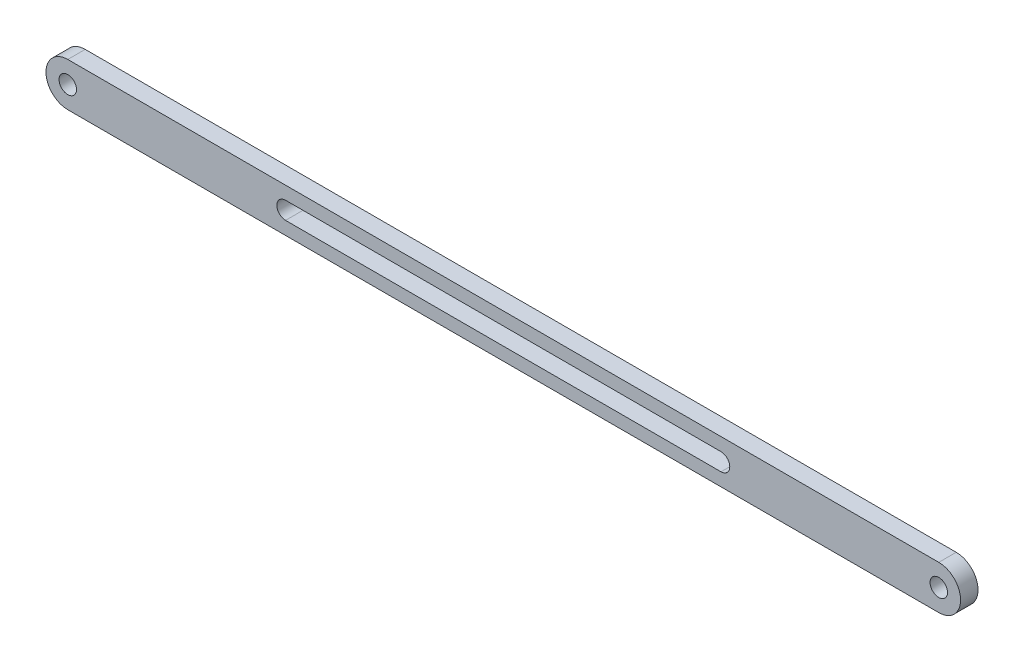
ISO-10303-21;
HEADER;
FILE_DESCRIPTION(('STEP AP214'),'2;1');
FILE_NAME('part.step','',(''),(''),'','','');
FILE_SCHEMA(('AUTOMOTIVE_DESIGN { 1 0 10303 214 1 1 1 1 }'));
ENDSEC;
DATA;
#1=APPLICATION_CONTEXT('core data for automotive mechanical design processes');
#2=APPLICATION_PROTOCOL_DEFINITION('international standard','automotive_design',2000,#1);
#3=PRODUCT_CONTEXT('',#1,'mechanical');
#4=PRODUCT('Part','Part','',(#3));
#5=PRODUCT_RELATED_PRODUCT_CATEGORY('part','',(#4));
#6=PRODUCT_DEFINITION_FORMATION('','',#4);
#7=PRODUCT_DEFINITION_CONTEXT('part definition',#1,'design');
#8=PRODUCT_DEFINITION('design','',#6,#7);
#9=PRODUCT_DEFINITION_SHAPE('','',#8);
#10=(LENGTH_UNIT() NAMED_UNIT(*) SI_UNIT(.MILLI.,.METRE.));
#11=(NAMED_UNIT(*) PLANE_ANGLE_UNIT() SI_UNIT($,.RADIAN.));
#12=(NAMED_UNIT(*) SI_UNIT($,.STERADIAN.) SOLID_ANGLE_UNIT());
#13=UNCERTAINTY_MEASURE_WITH_UNIT(LENGTH_MEASURE(1.E-05),#10,'distance_accuracy_value','');
#14=(GEOMETRIC_REPRESENTATION_CONTEXT(3) GLOBAL_UNCERTAINTY_ASSIGNED_CONTEXT((#13)) GLOBAL_UNIT_ASSIGNED_CONTEXT((#10,
#11,#12)) REPRESENTATION_CONTEXT('',''));
#15=CARTESIAN_POINT('',(0.,0.,0.));
#16=DIRECTION('',(0.,0.,1.));
#17=DIRECTION('',(1.,0.,0.));
#18=AXIS2_PLACEMENT_3D('',#15,#16,#17);
#19=CARTESIAN_POINT('',(0.,0.,4.));
#20=DIRECTION('',(0.,0.,1.));
#21=DIRECTION('',(1.,0.,0.));
#22=AXIS2_PLACEMENT_3D('',#19,#20,#21);
#23=PLANE('',#22);
#24=CARTESIAN_POINT('',(200.,0.,4.));
#25=DIRECTION('',(0.,0.,1.));
#26=DIRECTION('',(1.,0.,0.));
#27=AXIS2_PLACEMENT_3D('',#24,#25,#26);
#28=CIRCLE('',#27,2.);
#29=CARTESIAN_POINT('',(202.,0.,4.));
#30=VERTEX_POINT('',#29);
#31=EDGE_CURVE('E133',#30,#30,#28,.T.);
#32=ORIENTED_EDGE('',*,*,#31,.F.);
#33=EDGE_LOOP('',(#32));
#34=FACE_BOUND('',#33,.T.);
#35=CARTESIAN_POINT('',(0.,0.,4.));
#36=DIRECTION('',(0.,0.,1.));
#37=DIRECTION('',(1.,0.,0.));
#38=AXIS2_PLACEMENT_3D('',#35,#36,#37);
#39=CIRCLE('',#38,5.);
#40=CARTESIAN_POINT('',(0.,5.,4.));
#41=VERTEX_POINT('',#40);
#42=CARTESIAN_POINT('',(0.,-5.,4.));
#43=VERTEX_POINT('',#42);
#44=EDGE_CURVE('E145',#41,#43,#39,.T.);
#45=ORIENTED_EDGE('',*,*,#44,.T.);
#46=DIRECTION('',(1.,0.,0.));
#47=VECTOR('',#46,1.);
#48=CARTESIAN_POINT('',(0.,-5.,4.));
#49=LINE('',#48,#47);
#50=CARTESIAN_POINT('',(200.,-5.,4.));
#51=VERTEX_POINT('',#50);
#52=EDGE_CURVE('E148',#43,#51,#49,.T.);
#53=ORIENTED_EDGE('',*,*,#52,.T.);
#54=CARTESIAN_POINT('',(200.,0.,4.));
#55=DIRECTION('',(0.,0.,1.));
#56=DIRECTION('',(1.,0.,0.));
#57=AXIS2_PLACEMENT_3D('',#54,#55,#56);
#58=CIRCLE('',#57,5.);
#59=CARTESIAN_POINT('',(200.,5.,4.));
#60=VERTEX_POINT('',#59);
#61=EDGE_CURVE('E151',#51,#60,#58,.T.);
#62=ORIENTED_EDGE('',*,*,#61,.T.);
#63=DIRECTION('',(-1.,0.,0.));
#64=VECTOR('',#63,1.);
#65=CARTESIAN_POINT('',(0.,5.,4.));
#66=LINE('',#65,#64);
#67=EDGE_CURVE('E153',#60,#41,#66,.T.);
#68=ORIENTED_EDGE('',*,*,#67,.T.);
#69=EDGE_LOOP('',(#45,#53,#62,#68));
#70=FACE_BOUND('',#69,.T.);
#71=CARTESIAN_POINT('',(0.,0.,4.));
#72=DIRECTION('',(0.,0.,1.));
#73=DIRECTION('',(1.,0.,0.));
#74=AXIS2_PLACEMENT_3D('',#71,#72,#73);
#75=CIRCLE('',#74,2.);
#76=CARTESIAN_POINT('',(2.,0.,4.));
#77=VERTEX_POINT('',#76);
#78=EDGE_CURVE('E139',#77,#77,#75,.T.);
#79=ORIENTED_EDGE('',*,*,#78,.F.);
#80=EDGE_LOOP('',(#79));
#81=FACE_BOUND('',#80,.T.);
#82=DIRECTION('',(1.,0.,0.));
#83=VECTOR('',#82,1.);
#84=CARTESIAN_POINT('',(50.,-2.,4.));
#85=LINE('',#84,#83);
#86=CARTESIAN_POINT('',(50.,-2.,4.));
#87=VERTEX_POINT('',#86);
#88=CARTESIAN_POINT('',(150.,-1.99999999999998,4.));
#89=VERTEX_POINT('',#88);
#90=EDGE_CURVE('E105',#87,#89,#85,.T.);
#91=ORIENTED_EDGE('',*,*,#90,.F.);
#92=CARTESIAN_POINT('',(50.,0.,4.));
#93=DIRECTION('',(0.,0.,1.));
#94=DIRECTION('',(1.,0.,0.));
#95=AXIS2_PLACEMENT_3D('',#92,#93,#94);
#96=CIRCLE('',#95,2.);
#97=CARTESIAN_POINT('',(50.,2.,4.));
#98=VERTEX_POINT('',#97);
#99=EDGE_CURVE('E97',#98,#87,#96,.T.);
#100=ORIENTED_EDGE('',*,*,#99,.F.);
#101=DIRECTION('',(-1.,0.,0.));
#102=VECTOR('',#101,1.);
#103=CARTESIAN_POINT('',(50.,2.,4.));
#104=LINE('',#103,#102);
#105=CARTESIAN_POINT('',(150.,2.00000000000002,4.));
#106=VERTEX_POINT('',#105);
#107=EDGE_CURVE('E119',#106,#98,#104,.T.);
#108=ORIENTED_EDGE('',*,*,#107,.F.);
#109=CARTESIAN_POINT('',(150.,0.,4.));
#110=DIRECTION('',(0.,0.,1.));
#111=DIRECTION('',(1.,0.,0.));
#112=AXIS2_PLACEMENT_3D('',#109,#110,#111);
#113=CIRCLE('',#112,2.);
#114=EDGE_CURVE('E117',#89,#106,#113,.T.);
#115=ORIENTED_EDGE('',*,*,#114,.F.);
#116=EDGE_LOOP('',(#91,#100,#108,#115));
#117=FACE_BOUND('',#116,.T.);
#118=ADVANCED_FACE('F32',(#34,#70,#81,#117),#23,.T.);
#119=CARTESIAN_POINT('',(0.,0.,0.));
#120=DIRECTION('',(0.,0.,1.));
#121=DIRECTION('',(1.,0.,0.));
#122=AXIS2_PLACEMENT_3D('',#119,#120,#121);
#123=PLANE('',#122);
#124=CARTESIAN_POINT('',(200.,0.,0.));
#125=DIRECTION('',(0.,0.,1.));
#126=DIRECTION('',(1.,0.,0.));
#127=AXIS2_PLACEMENT_3D('',#124,#125,#126);
#128=CIRCLE('',#127,2.);
#129=CARTESIAN_POINT('',(202.,0.,0.));
#130=VERTEX_POINT('',#129);
#131=EDGE_CURVE('E113',#130,#130,#128,.T.);
#132=ORIENTED_EDGE('',*,*,#131,.T.);
#133=EDGE_LOOP('',(#132));
#134=FACE_BOUND('',#133,.T.);
#135=CARTESIAN_POINT('',(0.,0.,0.));
#136=DIRECTION('',(0.,0.,1.));
#137=DIRECTION('',(1.,0.,0.));
#138=AXIS2_PLACEMENT_3D('',#135,#136,#137);
#139=CIRCLE('',#138,5.);
#140=CARTESIAN_POINT('',(0.,5.,0.));
#141=VERTEX_POINT('',#140);
#142=CARTESIAN_POINT('',(0.,-5.,0.));
#143=VERTEX_POINT('',#142);
#144=EDGE_CURVE('E142',#141,#143,#139,.T.);
#145=ORIENTED_EDGE('',*,*,#144,.F.);
#146=DIRECTION('',(-1.,0.,0.));
#147=VECTOR('',#146,1.);
#148=CARTESIAN_POINT('',(0.,5.,0.));
#149=LINE('',#148,#147);
#150=CARTESIAN_POINT('',(200.,5.,0.));
#151=VERTEX_POINT('',#150);
#152=EDGE_CURVE('E149',#151,#141,#149,.T.);
#153=ORIENTED_EDGE('',*,*,#152,.F.);
#154=CARTESIAN_POINT('',(200.,0.,0.));
#155=DIRECTION('',(0.,0.,1.));
#156=DIRECTION('',(1.,0.,0.));
#157=AXIS2_PLACEMENT_3D('',#154,#155,#156);
#158=CIRCLE('',#157,5.);
#159=CARTESIAN_POINT('',(200.,-5.,0.));
#160=VERTEX_POINT('',#159);
#161=EDGE_CURVE('E160',#160,#151,#158,.T.);
#162=ORIENTED_EDGE('',*,*,#161,.F.);
#163=DIRECTION('',(1.,0.,0.));
#164=VECTOR('',#163,1.);
#165=CARTESIAN_POINT('',(0.,-5.,0.));
#166=LINE('',#165,#164);
#167=EDGE_CURVE('E158',#143,#160,#166,.T.);
#168=ORIENTED_EDGE('',*,*,#167,.F.);
#169=EDGE_LOOP('',(#145,#153,#162,#168));
#170=FACE_BOUND('',#169,.T.);
#171=CARTESIAN_POINT('',(0.,0.,0.));
#172=DIRECTION('',(0.,0.,1.));
#173=DIRECTION('',(1.,0.,0.));
#174=AXIS2_PLACEMENT_3D('',#171,#172,#173);
#175=CIRCLE('',#174,2.);
#176=CARTESIAN_POINT('',(2.,0.,0.));
#177=VERTEX_POINT('',#176);
#178=EDGE_CURVE('E136',#177,#177,#175,.T.);
#179=ORIENTED_EDGE('',*,*,#178,.T.);
#180=EDGE_LOOP('',(#179));
#181=FACE_BOUND('',#180,.T.);
#182=CARTESIAN_POINT('',(50.,0.,0.));
#183=DIRECTION('',(0.,0.,1.));
#184=DIRECTION('',(1.,0.,0.));
#185=AXIS2_PLACEMENT_3D('',#182,#183,#184);
#186=CIRCLE('',#185,2.);
#187=CARTESIAN_POINT('',(50.,2.,0.));
#188=VERTEX_POINT('',#187);
#189=CARTESIAN_POINT('',(50.,-2.,0.));
#190=VERTEX_POINT('',#189);
#191=EDGE_CURVE('E55',#188,#190,#186,.T.);
#192=ORIENTED_EDGE('',*,*,#191,.T.);
#193=DIRECTION('',(1.,0.,0.));
#194=VECTOR('',#193,1.);
#195=CARTESIAN_POINT('',(50.,-2.,0.));
#196=LINE('',#195,#194);
#197=CARTESIAN_POINT('',(150.,-1.99999999999998,0.));
#198=VERTEX_POINT('',#197);
#199=EDGE_CURVE('E112',#190,#198,#196,.T.);
#200=ORIENTED_EDGE('',*,*,#199,.T.);
#201=CARTESIAN_POINT('',(150.,0.,0.));
#202=DIRECTION('',(0.,0.,1.));
#203=DIRECTION('',(1.,0.,0.));
#204=AXIS2_PLACEMENT_3D('',#201,#202,#203);
#205=CIRCLE('',#204,2.);
#206=CARTESIAN_POINT('',(150.,2.00000000000002,0.));
#207=VERTEX_POINT('',#206);
#208=EDGE_CURVE('E125',#198,#207,#205,.T.);
#209=ORIENTED_EDGE('',*,*,#208,.T.);
#210=DIRECTION('',(-1.,0.,0.));
#211=VECTOR('',#210,1.);
#212=CARTESIAN_POINT('',(50.,2.,0.));
#213=LINE('',#212,#211);
#214=EDGE_CURVE('E106',#207,#188,#213,.T.);
#215=ORIENTED_EDGE('',*,*,#214,.T.);
#216=EDGE_LOOP('',(#192,#200,#209,#215));
#217=FACE_BOUND('',#216,.T.);
#218=ADVANCED_FACE('F178',(#134,#170,#181,#217),#123,.F.);
#219=CARTESIAN_POINT('',(0.,0.,4.));
#220=DIRECTION('',(0.,0.,-1.));
#221=DIRECTION('',(-1.,0.,0.));
#222=AXIS2_PLACEMENT_3D('',#219,#220,#221);
#223=CYLINDRICAL_SURFACE('',#222,5.);
#224=ORIENTED_EDGE('',*,*,#144,.T.);
#225=DIRECTION('',(0.,0.,-1.));
#226=VECTOR('',#225,1.);
#227=CARTESIAN_POINT('',(0.,-5.,4.));
#228=LINE('',#227,#226);
#229=EDGE_CURVE('E11',#43,#143,#228,.T.);
#230=ORIENTED_EDGE('',*,*,#229,.F.);
#231=ORIENTED_EDGE('',*,*,#44,.F.);
#232=DIRECTION('',(0.,0.,-1.));
#233=VECTOR('',#232,1.);
#234=CARTESIAN_POINT('',(0.,5.,4.));
#235=LINE('',#234,#233);
#236=EDGE_CURVE('E155',#41,#141,#235,.T.);
#237=ORIENTED_EDGE('',*,*,#236,.T.);
#238=EDGE_LOOP('',(#224,#230,#231,#237));
#239=FACE_BOUND('',#238,.T.);
#240=ADVANCED_FACE('F34',(#239),#223,.T.);
#241=CARTESIAN_POINT('',(0.,-5.,4.));
#242=DIRECTION('',(0.,1.,0.));
#243=DIRECTION('',(0.,0.,1.));
#244=AXIS2_PLACEMENT_3D('',#241,#242,#243);
#245=PLANE('',#244);
#246=ORIENTED_EDGE('',*,*,#167,.T.);
#247=DIRECTION('',(0.,0.,-1.));
#248=VECTOR('',#247,1.);
#249=CARTESIAN_POINT('',(200.,-5.,4.));
#250=LINE('',#249,#248);
#251=EDGE_CURVE('E40',#51,#160,#250,.T.);
#252=ORIENTED_EDGE('',*,*,#251,.F.);
#253=ORIENTED_EDGE('',*,*,#52,.F.);
#254=ORIENTED_EDGE('',*,*,#229,.T.);
#255=EDGE_LOOP('',(#246,#252,#253,#254));
#256=FACE_BOUND('',#255,.T.);
#257=ADVANCED_FACE('F189',(#256),#245,.F.);
#258=CARTESIAN_POINT('',(200.,0.,4.));
#259=DIRECTION('',(0.,0.,-1.));
#260=DIRECTION('',(-1.,0.,0.));
#261=AXIS2_PLACEMENT_3D('',#258,#259,#260);
#262=CYLINDRICAL_SURFACE('',#261,5.);
#263=ORIENTED_EDGE('',*,*,#161,.T.);
#264=DIRECTION('',(0.,0.,-1.));
#265=VECTOR('',#264,1.);
#266=CARTESIAN_POINT('',(200.,5.,4.));
#267=LINE('',#266,#265);
#268=EDGE_CURVE('E165',#60,#151,#267,.T.);
#269=ORIENTED_EDGE('',*,*,#268,.F.);
#270=ORIENTED_EDGE('',*,*,#61,.F.);
#271=ORIENTED_EDGE('',*,*,#251,.T.);
#272=EDGE_LOOP('',(#263,#269,#270,#271));
#273=FACE_BOUND('',#272,.T.);
#274=ADVANCED_FACE('F172',(#273),#262,.T.);
#275=CARTESIAN_POINT('',(0.,5.,4.));
#276=DIRECTION('',(0.,-1.,0.));
#277=DIRECTION('',(0.,0.,-1.));
#278=AXIS2_PLACEMENT_3D('',#275,#276,#277);
#279=PLANE('',#278);
#280=ORIENTED_EDGE('',*,*,#152,.T.);
#281=ORIENTED_EDGE('',*,*,#236,.F.);
#282=ORIENTED_EDGE('',*,*,#67,.F.);
#283=ORIENTED_EDGE('',*,*,#268,.T.);
#284=EDGE_LOOP('',(#280,#281,#282,#283));
#285=FACE_BOUND('',#284,.T.);
#286=ADVANCED_FACE('F182',(#285),#279,.F.);
#287=CARTESIAN_POINT('',(0.,0.,4.));
#288=DIRECTION('',(0.,0.,-1.));
#289=DIRECTION('',(-1.,0.,0.));
#290=AXIS2_PLACEMENT_3D('',#287,#288,#289);
#291=CYLINDRICAL_SURFACE('',#290,2.);
#292=ORIENTED_EDGE('',*,*,#78,.T.);
#293=EDGE_LOOP('',(#292));
#294=FACE_BOUND('',#293,.T.);
#295=ORIENTED_EDGE('',*,*,#178,.F.);
#296=EDGE_LOOP('',(#295));
#297=FACE_BOUND('',#296,.T.);
#298=ADVANCED_FACE('F206',(#294,#297),#291,.F.);
#299=CARTESIAN_POINT('',(200.,0.,4.));
#300=DIRECTION('',(0.,0.,-1.));
#301=DIRECTION('',(-1.,0.,0.));
#302=AXIS2_PLACEMENT_3D('',#299,#300,#301);
#303=CYLINDRICAL_SURFACE('',#302,2.);
#304=ORIENTED_EDGE('',*,*,#31,.T.);
#305=EDGE_LOOP('',(#304));
#306=FACE_BOUND('',#305,.T.);
#307=ORIENTED_EDGE('',*,*,#131,.F.);
#308=EDGE_LOOP('',(#307));
#309=FACE_BOUND('',#308,.T.);
#310=ADVANCED_FACE('F213',(#306,#309),#303,.F.);
#311=CARTESIAN_POINT('',(50.,0.,4.));
#312=DIRECTION('',(0.,0.,-1.));
#313=DIRECTION('',(-1.,0.,0.));
#314=AXIS2_PLACEMENT_3D('',#311,#312,#313);
#315=CYLINDRICAL_SURFACE('',#314,2.);
#316=ORIENTED_EDGE('',*,*,#191,.F.);
#317=DIRECTION('',(0.,0.,-1.));
#318=VECTOR('',#317,1.);
#319=CARTESIAN_POINT('',(50.,2.,4.));
#320=LINE('',#319,#318);
#321=EDGE_CURVE('E101',#98,#188,#320,.T.);
#322=ORIENTED_EDGE('',*,*,#321,.F.);
#323=ORIENTED_EDGE('',*,*,#99,.T.);
#324=DIRECTION('',(0.,0.,-1.));
#325=VECTOR('',#324,1.);
#326=CARTESIAN_POINT('',(50.,-2.,4.));
#327=LINE('',#326,#325);
#328=EDGE_CURVE('E100',#87,#190,#327,.T.);
#329=ORIENTED_EDGE('',*,*,#328,.T.);
#330=EDGE_LOOP('',(#316,#322,#323,#329));
#331=FACE_BOUND('',#330,.T.);
#332=ADVANCED_FACE('F99',(#331),#315,.F.);
#333=CARTESIAN_POINT('',(50.,-2.,4.));
#334=DIRECTION('',(0.,1.,0.));
#335=DIRECTION('',(-1.,0.,0.));
#336=AXIS2_PLACEMENT_3D('',#333,#334,#335);
#337=PLANE('',#336);
#338=ORIENTED_EDGE('',*,*,#199,.F.);
#339=ORIENTED_EDGE('',*,*,#328,.F.);
#340=ORIENTED_EDGE('',*,*,#90,.T.);
#341=DIRECTION('',(0.,0.,-1.));
#342=VECTOR('',#341,1.);
#343=CARTESIAN_POINT('',(150.,-1.99999999999998,4.));
#344=LINE('',#343,#342);
#345=EDGE_CURVE('E114',#89,#198,#344,.T.);
#346=ORIENTED_EDGE('',*,*,#345,.T.);
#347=EDGE_LOOP('',(#338,#339,#340,#346));
#348=FACE_BOUND('',#347,.T.);
#349=ADVANCED_FACE('F109',(#348),#337,.T.);
#350=CARTESIAN_POINT('',(150.,0.,4.));
#351=DIRECTION('',(0.,0.,-1.));
#352=DIRECTION('',(-1.,0.,0.));
#353=AXIS2_PLACEMENT_3D('',#350,#351,#352);
#354=CYLINDRICAL_SURFACE('',#353,2.);
#355=ORIENTED_EDGE('',*,*,#208,.F.);
#356=ORIENTED_EDGE('',*,*,#345,.F.);
#357=ORIENTED_EDGE('',*,*,#114,.T.);
#358=DIRECTION('',(0.,0.,-1.));
#359=VECTOR('',#358,1.);
#360=CARTESIAN_POINT('',(150.,2.00000000000002,4.));
#361=LINE('',#360,#359);
#362=EDGE_CURVE('E47',#106,#207,#361,.T.);
#363=ORIENTED_EDGE('',*,*,#362,.T.);
#364=EDGE_LOOP('',(#355,#356,#357,#363));
#365=FACE_BOUND('',#364,.T.);
#366=ADVANCED_FACE('F226',(#365),#354,.F.);
#367=CARTESIAN_POINT('',(50.,2.,4.));
#368=DIRECTION('',(0.,-1.,0.));
#369=DIRECTION('',(1.,0.,0.));
#370=AXIS2_PLACEMENT_3D('',#367,#368,#369);
#371=PLANE('',#370);
#372=ORIENTED_EDGE('',*,*,#214,.F.);
#373=ORIENTED_EDGE('',*,*,#362,.F.);
#374=ORIENTED_EDGE('',*,*,#107,.T.);
#375=ORIENTED_EDGE('',*,*,#321,.T.);
#376=EDGE_LOOP('',(#372,#373,#374,#375));
#377=FACE_BOUND('',#376,.T.);
#378=ADVANCED_FACE('F224',(#377),#371,.T.);
#379=CLOSED_SHELL('',(#118,#218,#240,#257,#274,#286,#298,#310,#332,#349,#366,#378));
#380=MANIFOLD_SOLID_BREP('B2',#379);
#381=ADVANCED_BREP_SHAPE_REPRESENTATION('',(#18,#380),#14);
#382=SHAPE_DEFINITION_REPRESENTATION(#9,#381);
ENDSEC;
END-ISO-10303-21;
